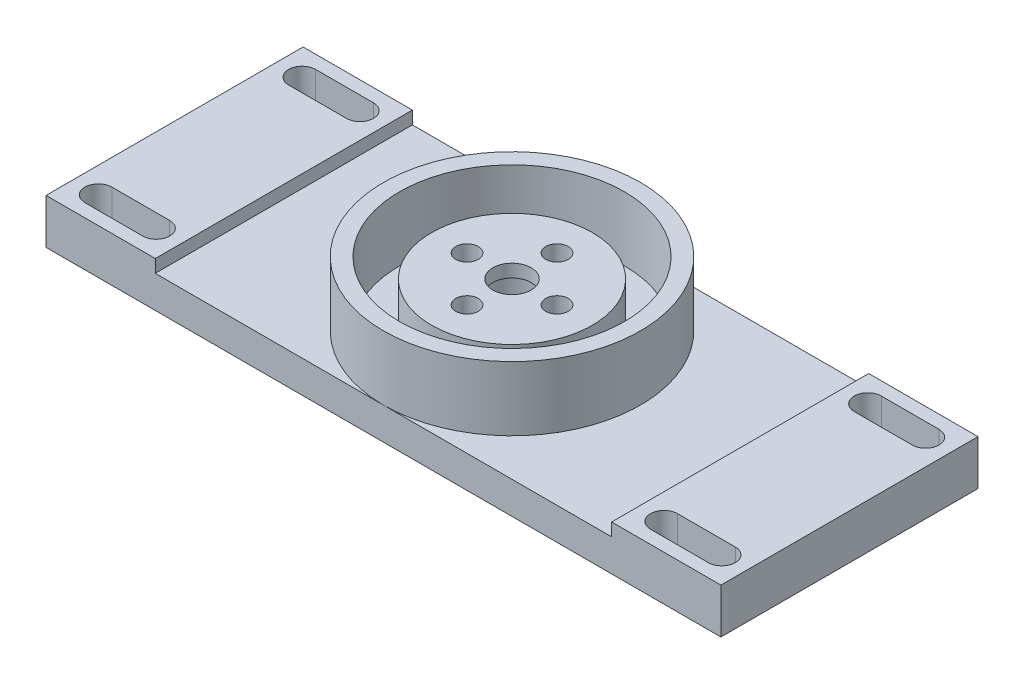
ISO-10303-21;
HEADER;
FILE_DESCRIPTION(('STEP AP214'),'2;1');
FILE_NAME('part.step','',(''),(''),'','','');
FILE_SCHEMA(('AUTOMOTIVE_DESIGN { 1 0 10303 214 1 1 1 1 }'));
ENDSEC;
DATA;
#1=APPLICATION_CONTEXT('core data for automotive mechanical design processes');
#2=APPLICATION_PROTOCOL_DEFINITION('international standard','automotive_design',2000,#1);
#3=PRODUCT_CONTEXT('',#1,'mechanical');
#4=PRODUCT('Part','Part','',(#3));
#5=PRODUCT_RELATED_PRODUCT_CATEGORY('part','',(#4));
#6=PRODUCT_DEFINITION_FORMATION('','',#4);
#7=PRODUCT_DEFINITION_CONTEXT('part definition',#1,'design');
#8=PRODUCT_DEFINITION('design','',#6,#7);
#9=PRODUCT_DEFINITION_SHAPE('','',#8);
#10=(LENGTH_UNIT() NAMED_UNIT(*) SI_UNIT(.MILLI.,.METRE.));
#11=(NAMED_UNIT(*) PLANE_ANGLE_UNIT() SI_UNIT($,.RADIAN.));
#12=(NAMED_UNIT(*) SI_UNIT($,.STERADIAN.) SOLID_ANGLE_UNIT());
#13=UNCERTAINTY_MEASURE_WITH_UNIT(LENGTH_MEASURE(1.E-05),#10,'distance_accuracy_value','');
#14=(GEOMETRIC_REPRESENTATION_CONTEXT(3) GLOBAL_UNCERTAINTY_ASSIGNED_CONTEXT((#13)) GLOBAL_UNIT_ASSIGNED_CONTEXT((#10,
#11,#12)) REPRESENTATION_CONTEXT('',''));
#15=CARTESIAN_POINT('',(0.,0.,0.));
#16=DIRECTION('',(0.,0.,1.));
#17=DIRECTION('',(1.,0.,0.));
#18=AXIS2_PLACEMENT_3D('',#15,#16,#17);
#19=CARTESIAN_POINT('',(52.5,0.,-20.));
#20=DIRECTION('',(0.,1.,0.));
#21=DIRECTION('',(0.,0.,1.));
#22=AXIS2_PLACEMENT_3D('',#19,#20,#21);
#23=CYLINDRICAL_SURFACE('',#22,3.);
#24=CARTESIAN_POINT('',(52.5,12.,-20.));
#25=DIRECTION('',(0.,1.,0.));
#26=DIRECTION('',(0.,0.,1.));
#27=AXIS2_PLACEMENT_3D('',#24,#25,#26);
#28=CIRCLE('',#27,3.);
#29=CARTESIAN_POINT('',(52.5,12.,-17.));
#30=VERTEX_POINT('',#29);
#31=EDGE_CURVE('E696',#30,#30,#28,.T.);
#32=ORIENTED_EDGE('',*,*,#31,.T.);
#33=EDGE_LOOP('',(#32));
#34=FACE_BOUND('',#33,.T.);
#35=CARTESIAN_POINT('',(52.5,10.,-20.));
#36=DIRECTION('',(0.,-1.,0.));
#37=DIRECTION('',(0.,0.,-1.));
#38=AXIS2_PLACEMENT_3D('',#35,#36,#37);
#39=CIRCLE('',#38,3.);
#40=CARTESIAN_POINT('',(52.5,10.,-23.));
#41=VERTEX_POINT('',#40);
#42=EDGE_CURVE('E45',#41,#41,#39,.F.);
#43=ORIENTED_EDGE('',*,*,#42,.F.);
#44=EDGE_LOOP('',(#43));
#45=FACE_BOUND('',#44,.T.);
#46=ADVANCED_FACE('F41',(#34,#45),#23,.F.);
#47=CARTESIAN_POINT('',(52.5,15.,-20.));
#48=DIRECTION('',(0.,-1.,0.));
#49=DIRECTION('',(0.,0.,-1.));
#50=AXIS2_PLACEMENT_3D('',#47,#48,#49);
#51=CYLINDRICAL_SURFACE('',#50,12.5);
#52=CARTESIAN_POINT('',(52.5,5.,-20.));
#53=DIRECTION('',(0.,-1.,0.));
#54=DIRECTION('',(0.,0.,-1.));
#55=AXIS2_PLACEMENT_3D('',#52,#53,#54);
#56=CIRCLE('',#55,12.5);
#57=CARTESIAN_POINT('',(52.5,5.,-32.5));
#58=VERTEX_POINT('',#57);
#59=EDGE_CURVE('E12',#58,#58,#56,.F.);
#60=ORIENTED_EDGE('',*,*,#59,.T.);
#61=EDGE_LOOP('',(#60));
#62=FACE_BOUND('',#61,.T.);
#63=CARTESIAN_POINT('',(52.5,12.,-20.));
#64=DIRECTION('',(0.,1.,0.));
#65=DIRECTION('',(0.,0.,1.));
#66=AXIS2_PLACEMENT_3D('',#63,#64,#65);
#67=CIRCLE('',#66,12.5);
#68=CARTESIAN_POINT('',(52.5,12.,-7.50000000000001));
#69=VERTEX_POINT('',#68);
#70=EDGE_CURVE('E238',#69,#69,#67,.T.);
#71=ORIENTED_EDGE('',*,*,#70,.F.);
#72=EDGE_LOOP('',(#71));
#73=FACE_BOUND('',#72,.T.);
#74=ADVANCED_FACE('F454',(#62,#73),#51,.T.);
#75=CARTESIAN_POINT('',(0.,5.,0.));
#76=DIRECTION('',(0.,-1.,0.));
#77=DIRECTION('',(0.,0.,-1.));
#78=AXIS2_PLACEMENT_3D('',#75,#76,#77);
#79=PLANE('',#78);
#80=CARTESIAN_POINT('',(52.5,5.,-20.));
#81=DIRECTION('',(0.,-1.,0.));
#82=DIRECTION('',(0.,0.,-1.));
#83=AXIS2_PLACEMENT_3D('',#80,#81,#82);
#84=CIRCLE('',#83,20.);
#85=CARTESIAN_POINT('',(52.5,5.,-40.));
#86=VERTEX_POINT('',#85);
#87=CARTESIAN_POINT('',(52.5,5.,0.));
#88=VERTEX_POINT('',#87);
#89=EDGE_CURVE('E50',#86,#88,#84,.F.);
#90=ORIENTED_EDGE('',*,*,#89,.F.);
#91=DIRECTION('',(-1.,0.,0.));
#92=VECTOR('',#91,1.);
#93=CARTESIAN_POINT('',(17.,5.,-40.));
#94=LINE('',#93,#92);
#95=CARTESIAN_POINT('',(17.,5.,-40.));
#96=VERTEX_POINT('',#95);
#97=EDGE_CURVE('E212',#86,#96,#94,.T.);
#98=ORIENTED_EDGE('',*,*,#97,.T.);
#99=DIRECTION('',(0.,0.,1.));
#100=VECTOR('',#99,1.);
#101=CARTESIAN_POINT('',(17.,5.,0.));
#102=LINE('',#101,#100);
#103=CARTESIAN_POINT('',(17.,5.,0.));
#104=VERTEX_POINT('',#103);
#105=EDGE_CURVE('E242',#96,#104,#102,.T.);
#106=ORIENTED_EDGE('',*,*,#105,.T.);
#107=DIRECTION('',(1.,0.,0.));
#108=VECTOR('',#107,1.);
#109=CARTESIAN_POINT('',(17.,5.,0.));
#110=LINE('',#109,#108);
#111=EDGE_CURVE('E226',#104,#88,#110,.T.);
#112=ORIENTED_EDGE('',*,*,#111,.T.);
#113=EDGE_LOOP('',(#90,#98,#106,#112));
#114=FACE_BOUND('',#113,.T.);
#115=ADVANCED_FACE('F224',(#114),#79,.F.);
#116=CARTESIAN_POINT('',(0.,7.,0.));
#117=DIRECTION('',(0.,-1.,0.));
#118=DIRECTION('',(0.,0.,-1.));
#119=AXIS2_PLACEMENT_3D('',#116,#117,#118);
#120=PLANE('',#119);
#121=CARTESIAN_POINT('',(4.00000000000033,7.,-4.15));
#122=DIRECTION('',(0.,1.,0.));
#123=DIRECTION('',(0.,0.,1.));
#124=AXIS2_PLACEMENT_3D('',#121,#122,#123);
#125=CIRCLE('',#124,2.1);
#126=CARTESIAN_POINT('',(4.00000000000033,7.,-6.25));
#127=VERTEX_POINT('',#126);
#128=CARTESIAN_POINT('',(4.00000000000033,7.,-2.05));
#129=VERTEX_POINT('',#128);
#130=EDGE_CURVE('E321',#127,#129,#125,.T.);
#131=ORIENTED_EDGE('',*,*,#130,.F.);
#132=DIRECTION('',(-1.,0.,0.));
#133=VECTOR('',#132,1.);
#134=CARTESIAN_POINT('',(4.00000000000033,7.,-6.25));
#135=LINE('',#134,#133);
#136=CARTESIAN_POINT('',(13.0000000000003,7.,-6.25));
#137=VERTEX_POINT('',#136);
#138=EDGE_CURVE('E329',#137,#127,#135,.T.);
#139=ORIENTED_EDGE('',*,*,#138,.F.);
#140=CARTESIAN_POINT('',(13.0000000000003,7.,-4.15));
#141=DIRECTION('',(0.,1.,0.));
#142=DIRECTION('',(0.,0.,1.));
#143=AXIS2_PLACEMENT_3D('',#140,#141,#142);
#144=CIRCLE('',#143,2.1);
#145=CARTESIAN_POINT('',(13.0000000000003,7.,-2.05));
#146=VERTEX_POINT('',#145);
#147=EDGE_CURVE('E326',#146,#137,#144,.T.);
#148=ORIENTED_EDGE('',*,*,#147,.F.);
#149=DIRECTION('',(1.,0.,0.));
#150=VECTOR('',#149,1.);
#151=CARTESIAN_POINT('',(4.00000000000033,7.,-2.05));
#152=LINE('',#151,#150);
#153=EDGE_CURVE('E323',#129,#146,#152,.T.);
#154=ORIENTED_EDGE('',*,*,#153,.F.);
#155=EDGE_LOOP('',(#131,#139,#148,#154));
#156=FACE_BOUND('',#155,.T.);
#157=CARTESIAN_POINT('',(4.,7.,-35.85));
#158=DIRECTION('',(0.,1.,0.));
#159=DIRECTION('',(0.,0.,1.));
#160=AXIS2_PLACEMENT_3D('',#157,#158,#159);
#161=CIRCLE('',#160,2.1);
#162=CARTESIAN_POINT('',(4.,7.,-37.95));
#163=VERTEX_POINT('',#162);
#164=CARTESIAN_POINT('',(4.,7.,-33.75));
#165=VERTEX_POINT('',#164);
#166=EDGE_CURVE('E352',#163,#165,#161,.T.);
#167=ORIENTED_EDGE('',*,*,#166,.F.);
#168=DIRECTION('',(-1.,0.,0.));
#169=VECTOR('',#168,1.);
#170=CARTESIAN_POINT('',(4.,7.,-37.95));
#171=LINE('',#170,#169);
#172=CARTESIAN_POINT('',(13.,7.,-37.95));
#173=VERTEX_POINT('',#172);
#174=EDGE_CURVE('E360',#173,#163,#171,.T.);
#175=ORIENTED_EDGE('',*,*,#174,.F.);
#176=CARTESIAN_POINT('',(13.,7.,-35.85));
#177=DIRECTION('',(0.,1.,0.));
#178=DIRECTION('',(0.,0.,1.));
#179=AXIS2_PLACEMENT_3D('',#176,#177,#178);
#180=CIRCLE('',#179,2.1);
#181=CARTESIAN_POINT('',(13.,7.,-33.75));
#182=VERTEX_POINT('',#181);
#183=EDGE_CURVE('E357',#182,#173,#180,.T.);
#184=ORIENTED_EDGE('',*,*,#183,.F.);
#185=DIRECTION('',(1.,0.,0.));
#186=VECTOR('',#185,1.);
#187=CARTESIAN_POINT('',(4.,7.,-33.75));
#188=LINE('',#187,#186);
#189=EDGE_CURVE('E354',#165,#182,#188,.T.);
#190=ORIENTED_EDGE('',*,*,#189,.F.);
#191=EDGE_LOOP('',(#167,#175,#184,#190));
#192=FACE_BOUND('',#191,.T.);
#193=DIRECTION('',(1.,0.,0.));
#194=VECTOR('',#193,1.);
#195=CARTESIAN_POINT('',(0.,7.,0.));
#196=LINE('',#195,#194);
#197=CARTESIAN_POINT('',(0.,7.,0.));
#198=VERTEX_POINT('',#197);
#199=CARTESIAN_POINT('',(17.,7.,0.));
#200=VERTEX_POINT('',#199);
#201=EDGE_CURVE('E388',#198,#200,#196,.T.);
#202=ORIENTED_EDGE('',*,*,#201,.T.);
#203=DIRECTION('',(0.,0.,1.));
#204=VECTOR('',#203,1.);
#205=CARTESIAN_POINT('',(17.,7.,0.));
#206=LINE('',#205,#204);
#207=CARTESIAN_POINT('',(17.,7.,-40.));
#208=VERTEX_POINT('',#207);
#209=EDGE_CURVE('E248',#208,#200,#206,.T.);
#210=ORIENTED_EDGE('',*,*,#209,.F.);
#211=DIRECTION('',(-1.,0.,0.));
#212=VECTOR('',#211,1.);
#213=CARTESIAN_POINT('',(0.,7.,-40.));
#214=LINE('',#213,#212);
#215=CARTESIAN_POINT('',(0.,7.,-40.));
#216=VERTEX_POINT('',#215);
#217=EDGE_CURVE('E393',#208,#216,#214,.T.);
#218=ORIENTED_EDGE('',*,*,#217,.T.);
#219=DIRECTION('',(0.,0.,1.));
#220=VECTOR('',#219,1.);
#221=CARTESIAN_POINT('',(0.,7.,0.));
#222=LINE('',#221,#220);
#223=EDGE_CURVE('E383',#216,#198,#222,.T.);
#224=ORIENTED_EDGE('',*,*,#223,.T.);
#225=EDGE_LOOP('',(#202,#210,#218,#224));
#226=FACE_BOUND('',#225,.T.);
#227=ADVANCED_FACE('F493',(#156,#192,#226),#120,.F.);
#228=CARTESIAN_POINT('',(92.,7.,-35.85));
#229=DIRECTION('',(0.,1.,0.));
#230=DIRECTION('',(0.,0.,1.));
#231=AXIS2_PLACEMENT_3D('',#228,#229,#230);
#232=CIRCLE('',#231,2.1);
#233=CARTESIAN_POINT('',(92.,7.,-37.95));
#234=VERTEX_POINT('',#233);
#235=CARTESIAN_POINT('',(92.,7.,-33.75));
#236=VERTEX_POINT('',#235);
#237=EDGE_CURVE('E290',#234,#236,#232,.T.);
#238=ORIENTED_EDGE('',*,*,#237,.F.);
#239=DIRECTION('',(-1.,0.,0.));
#240=VECTOR('',#239,1.);
#241=CARTESIAN_POINT('',(92.,7.,-37.95));
#242=LINE('',#241,#240);
#243=CARTESIAN_POINT('',(101.,7.,-37.95));
#244=VERTEX_POINT('',#243);
#245=EDGE_CURVE('E298',#244,#234,#242,.T.);
#246=ORIENTED_EDGE('',*,*,#245,.F.);
#247=CARTESIAN_POINT('',(101.,7.,-35.85));
#248=DIRECTION('',(0.,1.,0.));
#249=DIRECTION('',(0.,0.,1.));
#250=AXIS2_PLACEMENT_3D('',#247,#248,#249);
#251=CIRCLE('',#250,2.1);
#252=CARTESIAN_POINT('',(101.,7.,-33.75));
#253=VERTEX_POINT('',#252);
#254=EDGE_CURVE('E295',#253,#244,#251,.T.);
#255=ORIENTED_EDGE('',*,*,#254,.F.);
#256=DIRECTION('',(1.,0.,0.));
#257=VECTOR('',#256,1.);
#258=CARTESIAN_POINT('',(92.,7.,-33.75));
#259=LINE('',#258,#257);
#260=EDGE_CURVE('E292',#236,#253,#259,.T.);
#261=ORIENTED_EDGE('',*,*,#260,.F.);
#262=EDGE_LOOP('',(#238,#246,#255,#261));
#263=FACE_BOUND('',#262,.T.);
#264=CARTESIAN_POINT('',(105.,7.,-40.));
#265=VERTEX_POINT('',#264);
#266=CARTESIAN_POINT('',(88.,7.,-40.));
#267=VERTEX_POINT('',#266);
#268=EDGE_CURVE('E394',#265,#267,#214,.T.);
#269=ORIENTED_EDGE('',*,*,#268,.T.);
#270=DIRECTION('',(0.,0.,-1.));
#271=VECTOR('',#270,1.);
#272=CARTESIAN_POINT('',(88.,7.,0.));
#273=LINE('',#272,#271);
#274=CARTESIAN_POINT('',(88.,7.,0.));
#275=VERTEX_POINT('',#274);
#276=EDGE_CURVE('E245',#275,#267,#273,.T.);
#277=ORIENTED_EDGE('',*,*,#276,.F.);
#278=CARTESIAN_POINT('',(105.,7.,0.));
#279=VERTEX_POINT('',#278);
#280=EDGE_CURVE('E386',#275,#279,#196,.T.);
#281=ORIENTED_EDGE('',*,*,#280,.T.);
#282=DIRECTION('',(0.,0.,-1.));
#283=VECTOR('',#282,1.);
#284=CARTESIAN_POINT('',(105.,7.,0.));
#285=LINE('',#284,#283);
#286=EDGE_CURVE('E391',#279,#265,#285,.T.);
#287=ORIENTED_EDGE('',*,*,#286,.T.);
#288=EDGE_LOOP('',(#269,#277,#281,#287));
#289=FACE_BOUND('',#288,.T.);
#290=CARTESIAN_POINT('',(92.0000000000003,7.,-4.15));
#291=DIRECTION('',(0.,1.,0.));
#292=DIRECTION('',(0.,0.,1.));
#293=AXIS2_PLACEMENT_3D('',#290,#291,#292);
#294=CIRCLE('',#293,2.1);
#295=CARTESIAN_POINT('',(92.0000000000003,7.,-6.25));
#296=VERTEX_POINT('',#295);
#297=CARTESIAN_POINT('',(92.0000000000003,7.,-2.05));
#298=VERTEX_POINT('',#297);
#299=EDGE_CURVE('E259',#296,#298,#294,.T.);
#300=ORIENTED_EDGE('',*,*,#299,.F.);
#301=DIRECTION('',(-1.,0.,0.));
#302=VECTOR('',#301,1.);
#303=CARTESIAN_POINT('',(92.0000000000003,7.,-6.25));
#304=LINE('',#303,#302);
#305=CARTESIAN_POINT('',(101.,7.,-6.25));
#306=VERTEX_POINT('',#305);
#307=EDGE_CURVE('E267',#306,#296,#304,.T.);
#308=ORIENTED_EDGE('',*,*,#307,.F.);
#309=CARTESIAN_POINT('',(101.,7.,-4.15));
#310=DIRECTION('',(0.,1.,0.));
#311=DIRECTION('',(0.,0.,1.));
#312=AXIS2_PLACEMENT_3D('',#309,#310,#311);
#313=CIRCLE('',#312,2.1);
#314=CARTESIAN_POINT('',(101.,7.,-2.05));
#315=VERTEX_POINT('',#314);
#316=EDGE_CURVE('E264',#315,#306,#313,.T.);
#317=ORIENTED_EDGE('',*,*,#316,.F.);
#318=DIRECTION('',(1.,0.,0.));
#319=VECTOR('',#318,1.);
#320=CARTESIAN_POINT('',(92.0000000000003,7.,-2.05));
#321=LINE('',#320,#319);
#322=EDGE_CURVE('E261',#298,#315,#321,.T.);
#323=ORIENTED_EDGE('',*,*,#322,.F.);
#324=EDGE_LOOP('',(#300,#308,#317,#323));
#325=FACE_BOUND('',#324,.T.);
#326=ADVANCED_FACE('F434',(#263,#289,#325),#120,.F.);
#327=CARTESIAN_POINT('',(0.,0.,0.));
#328=DIRECTION('',(0.,-1.,0.));
#329=DIRECTION('',(0.,0.,-1.));
#330=AXIS2_PLACEMENT_3D('',#327,#328,#329);
#331=PLANE('',#330);
#332=CARTESIAN_POINT('',(52.5,0.,-20.));
#333=DIRECTION('',(0.,-1.,0.));
#334=DIRECTION('',(0.,0.,-1.));
#335=AXIS2_PLACEMENT_3D('',#332,#333,#334);
#336=CIRCLE('',#335,4.5);
#337=CARTESIAN_POINT('',(52.5,0.,-24.5));
#338=VERTEX_POINT('',#337);
#339=EDGE_CURVE('E670',#338,#338,#336,.T.);
#340=ORIENTED_EDGE('',*,*,#339,.F.);
#341=EDGE_LOOP('',(#340));
#342=FACE_BOUND('',#341,.T.);
#343=CARTESIAN_POINT('',(52.5000000000001,0.,-12.9999999999997));
#344=DIRECTION('',(0.,1.,0.));
#345=DIRECTION('',(0.,0.,1.));
#346=AXIS2_PLACEMENT_3D('',#343,#344,#345);
#347=CIRCLE('',#346,1.75000000000001);
#348=CARTESIAN_POINT('',(52.5000000000001,0.,-11.2499999999997));
#349=VERTEX_POINT('',#348);
#350=EDGE_CURVE('E674',#349,#349,#347,.T.);
#351=ORIENTED_EDGE('',*,*,#350,.T.);
#352=EDGE_LOOP('',(#351));
#353=FACE_BOUND('',#352,.T.);
#354=CARTESIAN_POINT('',(59.5,0.,-20.));
#355=DIRECTION('',(0.,1.,0.));
#356=DIRECTION('',(0.,0.,1.));
#357=AXIS2_PLACEMENT_3D('',#354,#355,#356);
#358=CIRCLE('',#357,1.74999999999976);
#359=CARTESIAN_POINT('',(59.5,0.,-18.2500000000002));
#360=VERTEX_POINT('',#359);
#361=EDGE_CURVE('E681',#360,#360,#358,.T.);
#362=ORIENTED_EDGE('',*,*,#361,.T.);
#363=EDGE_LOOP('',(#362));
#364=FACE_BOUND('',#363,.T.);
#365=CARTESIAN_POINT('',(52.5,0.,-27.));
#366=DIRECTION('',(0.,1.,0.));
#367=DIRECTION('',(0.,0.,1.));
#368=AXIS2_PLACEMENT_3D('',#365,#366,#367);
#369=CIRCLE('',#368,1.74999999999848);
#370=CARTESIAN_POINT('',(52.5,0.,-25.2500000000015));
#371=VERTEX_POINT('',#370);
#372=EDGE_CURVE('E687',#371,#371,#369,.T.);
#373=ORIENTED_EDGE('',*,*,#372,.T.);
#374=EDGE_LOOP('',(#373));
#375=FACE_BOUND('',#374,.T.);
#376=CARTESIAN_POINT('',(45.5,0.,-20.));
#377=DIRECTION('',(0.,1.,0.));
#378=DIRECTION('',(0.,0.,1.));
#379=AXIS2_PLACEMENT_3D('',#376,#377,#378);
#380=CIRCLE('',#379,1.75);
#381=CARTESIAN_POINT('',(45.5,0.,-18.25));
#382=VERTEX_POINT('',#381);
#383=EDGE_CURVE('E693',#382,#382,#380,.T.);
#384=ORIENTED_EDGE('',*,*,#383,.T.);
#385=EDGE_LOOP('',(#384));
#386=FACE_BOUND('',#385,.T.);
#387=DIRECTION('',(0.,0.,1.));
#388=VECTOR('',#387,1.);
#389=CARTESIAN_POINT('',(0.,0.,0.));
#390=LINE('',#389,#388);
#391=CARTESIAN_POINT('',(0.,0.,-40.));
#392=VERTEX_POINT('',#391);
#393=CARTESIAN_POINT('',(0.,0.,0.));
#394=VERTEX_POINT('',#393);
#395=EDGE_CURVE('E382',#392,#394,#390,.T.);
#396=ORIENTED_EDGE('',*,*,#395,.F.);
#397=DIRECTION('',(-1.,0.,0.));
#398=VECTOR('',#397,1.);
#399=CARTESIAN_POINT('',(0.,0.,-40.));
#400=LINE('',#399,#398);
#401=CARTESIAN_POINT('',(105.,0.,-40.));
#402=VERTEX_POINT('',#401);
#403=EDGE_CURVE('E387',#402,#392,#400,.T.);
#404=ORIENTED_EDGE('',*,*,#403,.F.);
#405=DIRECTION('',(0.,0.,-1.));
#406=VECTOR('',#405,1.);
#407=CARTESIAN_POINT('',(105.,0.,0.));
#408=LINE('',#407,#406);
#409=CARTESIAN_POINT('',(105.,0.,0.));
#410=VERTEX_POINT('',#409);
#411=EDGE_CURVE('E402',#410,#402,#408,.T.);
#412=ORIENTED_EDGE('',*,*,#411,.F.);
#413=DIRECTION('',(1.,0.,0.));
#414=VECTOR('',#413,1.);
#415=CARTESIAN_POINT('',(0.,0.,0.));
#416=LINE('',#415,#414);
#417=EDGE_CURVE('E400',#394,#410,#416,.T.);
#418=ORIENTED_EDGE('',*,*,#417,.F.);
#419=EDGE_LOOP('',(#396,#404,#412,#418));
#420=FACE_BOUND('',#419,.T.);
#421=DIRECTION('',(-1.,0.,0.));
#422=VECTOR('',#421,1.);
#423=CARTESIAN_POINT('',(4.,0.,-37.95));
#424=LINE('',#423,#422);
#425=CARTESIAN_POINT('',(13.,0.,-37.95));
#426=VERTEX_POINT('',#425);
#427=CARTESIAN_POINT('',(4.,0.,-37.95));
#428=VERTEX_POINT('',#427);
#429=EDGE_CURVE('E355',#426,#428,#424,.T.);
#430=ORIENTED_EDGE('',*,*,#429,.T.);
#431=CARTESIAN_POINT('',(4.,0.,-35.85));
#432=DIRECTION('',(0.,1.,0.));
#433=DIRECTION('',(0.,0.,1.));
#434=AXIS2_PLACEMENT_3D('',#431,#432,#433);
#435=CIRCLE('',#434,2.1);
#436=CARTESIAN_POINT('',(4.,0.,-33.75));
#437=VERTEX_POINT('',#436);
#438=EDGE_CURVE('E351',#428,#437,#435,.T.);
#439=ORIENTED_EDGE('',*,*,#438,.T.);
#440=DIRECTION('',(1.,0.,0.));
#441=VECTOR('',#440,1.);
#442=CARTESIAN_POINT('',(4.,0.,-33.75));
#443=LINE('',#442,#441);
#444=CARTESIAN_POINT('',(13.,0.,-33.75));
#445=VERTEX_POINT('',#444);
#446=EDGE_CURVE('E365',#437,#445,#443,.T.);
#447=ORIENTED_EDGE('',*,*,#446,.T.);
#448=CARTESIAN_POINT('',(13.,0.,-35.85));
#449=DIRECTION('',(0.,1.,0.));
#450=DIRECTION('',(0.,0.,1.));
#451=AXIS2_PLACEMENT_3D('',#448,#449,#450);
#452=CIRCLE('',#451,2.1);
#453=EDGE_CURVE('E368',#445,#426,#452,.T.);
#454=ORIENTED_EDGE('',*,*,#453,.T.);
#455=EDGE_LOOP('',(#430,#439,#447,#454));
#456=FACE_BOUND('',#455,.T.);
#457=DIRECTION('',(-1.,0.,0.));
#458=VECTOR('',#457,1.);
#459=CARTESIAN_POINT('',(4.00000000000033,0.,-6.25));
#460=LINE('',#459,#458);
#461=CARTESIAN_POINT('',(13.0000000000003,0.,-6.25));
#462=VERTEX_POINT('',#461);
#463=CARTESIAN_POINT('',(4.00000000000033,0.,-6.25));
#464=VERTEX_POINT('',#463);
#465=EDGE_CURVE('E324',#462,#464,#460,.T.);
#466=ORIENTED_EDGE('',*,*,#465,.T.);
#467=CARTESIAN_POINT('',(4.00000000000033,0.,-4.15));
#468=DIRECTION('',(0.,1.,0.));
#469=DIRECTION('',(0.,0.,1.));
#470=AXIS2_PLACEMENT_3D('',#467,#468,#469);
#471=CIRCLE('',#470,2.1);
#472=CARTESIAN_POINT('',(4.00000000000033,0.,-2.05));
#473=VERTEX_POINT('',#472);
#474=EDGE_CURVE('E320',#464,#473,#471,.T.);
#475=ORIENTED_EDGE('',*,*,#474,.T.);
#476=DIRECTION('',(1.,0.,0.));
#477=VECTOR('',#476,1.);
#478=CARTESIAN_POINT('',(4.00000000000033,0.,-2.05));
#479=LINE('',#478,#477);
#480=CARTESIAN_POINT('',(13.0000000000003,0.,-2.05));
#481=VERTEX_POINT('',#480);
#482=EDGE_CURVE('E334',#473,#481,#479,.T.);
#483=ORIENTED_EDGE('',*,*,#482,.T.);
#484=CARTESIAN_POINT('',(13.0000000000003,0.,-4.15));
#485=DIRECTION('',(0.,1.,0.));
#486=DIRECTION('',(0.,0.,1.));
#487=AXIS2_PLACEMENT_3D('',#484,#485,#486);
#488=CIRCLE('',#487,2.1);
#489=EDGE_CURVE('E337',#481,#462,#488,.T.);
#490=ORIENTED_EDGE('',*,*,#489,.T.);
#491=EDGE_LOOP('',(#466,#475,#483,#490));
#492=FACE_BOUND('',#491,.T.);
#493=DIRECTION('',(-1.,0.,0.));
#494=VECTOR('',#493,1.);
#495=CARTESIAN_POINT('',(92.,0.,-37.95));
#496=LINE('',#495,#494);
#497=CARTESIAN_POINT('',(101.,0.,-37.95));
#498=VERTEX_POINT('',#497);
#499=CARTESIAN_POINT('',(92.,0.,-37.95));
#500=VERTEX_POINT('',#499);
#501=EDGE_CURVE('E293',#498,#500,#496,.T.);
#502=ORIENTED_EDGE('',*,*,#501,.T.);
#503=CARTESIAN_POINT('',(92.,0.,-35.85));
#504=DIRECTION('',(0.,1.,0.));
#505=DIRECTION('',(0.,0.,1.));
#506=AXIS2_PLACEMENT_3D('',#503,#504,#505);
#507=CIRCLE('',#506,2.1);
#508=CARTESIAN_POINT('',(92.,0.,-33.75));
#509=VERTEX_POINT('',#508);
#510=EDGE_CURVE('E289',#500,#509,#507,.T.);
#511=ORIENTED_EDGE('',*,*,#510,.T.);
#512=DIRECTION('',(1.,0.,0.));
#513=VECTOR('',#512,1.);
#514=CARTESIAN_POINT('',(92.,0.,-33.75));
#515=LINE('',#514,#513);
#516=CARTESIAN_POINT('',(101.,0.,-33.75));
#517=VERTEX_POINT('',#516);
#518=EDGE_CURVE('E303',#509,#517,#515,.T.);
#519=ORIENTED_EDGE('',*,*,#518,.T.);
#520=CARTESIAN_POINT('',(101.,0.,-35.85));
#521=DIRECTION('',(0.,1.,0.));
#522=DIRECTION('',(0.,0.,1.));
#523=AXIS2_PLACEMENT_3D('',#520,#521,#522);
#524=CIRCLE('',#523,2.1);
#525=EDGE_CURVE('E306',#517,#498,#524,.T.);
#526=ORIENTED_EDGE('',*,*,#525,.T.);
#527=EDGE_LOOP('',(#502,#511,#519,#526));
#528=FACE_BOUND('',#527,.T.);
#529=DIRECTION('',(-1.,0.,0.));
#530=VECTOR('',#529,1.);
#531=CARTESIAN_POINT('',(92.0000000000003,0.,-6.25));
#532=LINE('',#531,#530);
#533=CARTESIAN_POINT('',(101.,0.,-6.25));
#534=VERTEX_POINT('',#533);
#535=CARTESIAN_POINT('',(92.0000000000003,0.,-6.25));
#536=VERTEX_POINT('',#535);
#537=EDGE_CURVE('E262',#534,#536,#532,.T.);
#538=ORIENTED_EDGE('',*,*,#537,.T.);
#539=CARTESIAN_POINT('',(92.0000000000003,0.,-4.15));
#540=DIRECTION('',(0.,1.,0.));
#541=DIRECTION('',(0.,0.,1.));
#542=AXIS2_PLACEMENT_3D('',#539,#540,#541);
#543=CIRCLE('',#542,2.1);
#544=CARTESIAN_POINT('',(92.0000000000003,0.,-2.05));
#545=VERTEX_POINT('',#544);
#546=EDGE_CURVE('E252',#536,#545,#543,.T.);
#547=ORIENTED_EDGE('',*,*,#546,.T.);
#548=DIRECTION('',(1.,0.,0.));
#549=VECTOR('',#548,1.);
#550=CARTESIAN_POINT('',(92.0000000000003,0.,-2.05));
#551=LINE('',#550,#549);
#552=CARTESIAN_POINT('',(101.,0.,-2.05));
#553=VERTEX_POINT('',#552);
#554=EDGE_CURVE('E272',#545,#553,#551,.T.);
#555=ORIENTED_EDGE('',*,*,#554,.T.);
#556=CARTESIAN_POINT('',(101.,0.,-4.15));
#557=DIRECTION('',(0.,1.,0.));
#558=DIRECTION('',(0.,0.,1.));
#559=AXIS2_PLACEMENT_3D('',#556,#557,#558);
#560=CIRCLE('',#559,2.1);
#561=EDGE_CURVE('E275',#553,#534,#560,.T.);
#562=ORIENTED_EDGE('',*,*,#561,.T.);
#563=EDGE_LOOP('',(#538,#547,#555,#562));
#564=FACE_BOUND('',#563,.T.);
#565=ADVANCED_FACE('F424',(#342,#353,#364,#375,#386,#420,#456,#492,#528,#564),#331,.T.);
#566=CARTESIAN_POINT('',(0.,7.,0.));
#567=DIRECTION('',(1.,0.,0.));
#568=DIRECTION('',(0.,0.,-1.));
#569=AXIS2_PLACEMENT_3D('',#566,#567,#568);
#570=PLANE('',#569);
#571=ORIENTED_EDGE('',*,*,#395,.T.);
#572=DIRECTION('',(0.,-1.,0.));
#573=VECTOR('',#572,1.);
#574=CARTESIAN_POINT('',(0.,7.,0.));
#575=LINE('',#574,#573);
#576=EDGE_CURVE('E228',#198,#394,#575,.T.);
#577=ORIENTED_EDGE('',*,*,#576,.F.);
#578=ORIENTED_EDGE('',*,*,#223,.F.);
#579=DIRECTION('',(0.,-1.,0.));
#580=VECTOR('',#579,1.);
#581=CARTESIAN_POINT('',(0.,7.,-40.));
#582=LINE('',#581,#580);
#583=EDGE_CURVE('E397',#216,#392,#582,.T.);
#584=ORIENTED_EDGE('',*,*,#583,.T.);
#585=EDGE_LOOP('',(#571,#577,#578,#584));
#586=FACE_BOUND('',#585,.T.);
#587=ADVANCED_FACE('F43',(#586),#570,.F.);
#588=CARTESIAN_POINT('',(0.,7.,0.));
#589=DIRECTION('',(0.,0.,-1.));
#590=DIRECTION('',(-1.,0.,0.));
#591=AXIS2_PLACEMENT_3D('',#588,#589,#590);
#592=PLANE('',#591);
#593=ORIENTED_EDGE('',*,*,#111,.F.);
#594=DIRECTION('',(0.,1.,0.));
#595=VECTOR('',#594,1.);
#596=CARTESIAN_POINT('',(17.,5.,0.));
#597=LINE('',#596,#595);
#598=EDGE_CURVE('E211',#104,#200,#597,.T.);
#599=ORIENTED_EDGE('',*,*,#598,.T.);
#600=ORIENTED_EDGE('',*,*,#201,.F.);
#601=ORIENTED_EDGE('',*,*,#576,.T.);
#602=ORIENTED_EDGE('',*,*,#417,.T.);
#603=DIRECTION('',(0.,-1.,0.));
#604=VECTOR('',#603,1.);
#605=CARTESIAN_POINT('',(105.,7.,0.));
#606=LINE('',#605,#604);
#607=EDGE_CURVE('E410',#279,#410,#606,.T.);
#608=ORIENTED_EDGE('',*,*,#607,.F.);
#609=ORIENTED_EDGE('',*,*,#280,.F.);
#610=DIRECTION('',(0.,1.,0.));
#611=VECTOR('',#610,1.);
#612=CARTESIAN_POINT('',(88.,5.,0.));
#613=LINE('',#612,#611);
#614=CARTESIAN_POINT('',(88.,5.,0.));
#615=VERTEX_POINT('',#614);
#616=EDGE_CURVE('E255',#615,#275,#613,.T.);
#617=ORIENTED_EDGE('',*,*,#616,.F.);
#618=EDGE_CURVE('E244',#88,#615,#110,.T.);
#619=ORIENTED_EDGE('',*,*,#618,.F.);
#620=EDGE_LOOP('',(#593,#599,#600,#601,#602,#608,#609,#617,#619));
#621=FACE_BOUND('',#620,.T.);
#622=ADVANCED_FACE('F416',(#621),#592,.F.);
#623=CARTESIAN_POINT('',(105.,7.,0.));
#624=DIRECTION('',(-1.,0.,0.));
#625=DIRECTION('',(0.,0.,1.));
#626=AXIS2_PLACEMENT_3D('',#623,#624,#625);
#627=PLANE('',#626);
#628=ORIENTED_EDGE('',*,*,#411,.T.);
#629=DIRECTION('',(0.,-1.,0.));
#630=VECTOR('',#629,1.);
#631=CARTESIAN_POINT('',(105.,7.,-40.));
#632=LINE('',#631,#630);
#633=EDGE_CURVE('E407',#265,#402,#632,.T.);
#634=ORIENTED_EDGE('',*,*,#633,.F.);
#635=ORIENTED_EDGE('',*,*,#286,.F.);
#636=ORIENTED_EDGE('',*,*,#607,.T.);
#637=EDGE_LOOP('',(#628,#634,#635,#636));
#638=FACE_BOUND('',#637,.T.);
#639=ADVANCED_FACE('F429',(#638),#627,.F.);
#640=CARTESIAN_POINT('',(0.,7.,-40.));
#641=DIRECTION('',(0.,0.,1.));
#642=DIRECTION('',(1.,0.,0.));
#643=AXIS2_PLACEMENT_3D('',#640,#641,#642);
#644=PLANE('',#643);
#645=ORIENTED_EDGE('',*,*,#217,.F.);
#646=DIRECTION('',(0.,1.,0.));
#647=VECTOR('',#646,1.);
#648=CARTESIAN_POINT('',(17.,5.,-40.));
#649=LINE('',#648,#647);
#650=EDGE_CURVE('E218',#96,#208,#649,.T.);
#651=ORIENTED_EDGE('',*,*,#650,.F.);
#652=ORIENTED_EDGE('',*,*,#97,.F.);
#653=CARTESIAN_POINT('',(88.,5.,-40.));
#654=VERTEX_POINT('',#653);
#655=EDGE_CURVE('E206',#654,#86,#94,.T.);
#656=ORIENTED_EDGE('',*,*,#655,.F.);
#657=DIRECTION('',(0.,1.,0.));
#658=VECTOR('',#657,1.);
#659=CARTESIAN_POINT('',(88.,5.,-40.));
#660=LINE('',#659,#658);
#661=EDGE_CURVE('E253',#654,#267,#660,.T.);
#662=ORIENTED_EDGE('',*,*,#661,.T.);
#663=ORIENTED_EDGE('',*,*,#268,.F.);
#664=ORIENTED_EDGE('',*,*,#633,.T.);
#665=ORIENTED_EDGE('',*,*,#403,.T.);
#666=ORIENTED_EDGE('',*,*,#583,.F.);
#667=EDGE_LOOP('',(#645,#651,#652,#656,#662,#663,#664,#665,#666));
#668=FACE_BOUND('',#667,.T.);
#669=ADVANCED_FACE('F217',(#668),#644,.F.);
#670=CARTESIAN_POINT('',(4.,7.,-35.85));
#671=DIRECTION('',(0.,-1.,0.));
#672=DIRECTION('',(0.,0.,-1.));
#673=AXIS2_PLACEMENT_3D('',#670,#671,#672);
#674=CYLINDRICAL_SURFACE('',#673,2.1);
#675=ORIENTED_EDGE('',*,*,#438,.F.);
#676=DIRECTION('',(0.,-1.,0.));
#677=VECTOR('',#676,1.);
#678=CARTESIAN_POINT('',(4.,7.,-37.95));
#679=LINE('',#678,#677);
#680=EDGE_CURVE('E362',#163,#428,#679,.T.);
#681=ORIENTED_EDGE('',*,*,#680,.F.);
#682=ORIENTED_EDGE('',*,*,#166,.T.);
#683=DIRECTION('',(0.,-1.,0.));
#684=VECTOR('',#683,1.);
#685=CARTESIAN_POINT('',(4.,7.,-33.75));
#686=LINE('',#685,#684);
#687=EDGE_CURVE('E379',#165,#437,#686,.T.);
#688=ORIENTED_EDGE('',*,*,#687,.T.);
#689=EDGE_LOOP('',(#675,#681,#682,#688));
#690=FACE_BOUND('',#689,.T.);
#691=ADVANCED_FACE('F507',(#690),#674,.F.);
#692=CARTESIAN_POINT('',(4.,7.,-33.75));
#693=DIRECTION('',(0.,0.,-1.));
#694=DIRECTION('',(-1.,0.,0.));
#695=AXIS2_PLACEMENT_3D('',#692,#693,#694);
#696=PLANE('',#695);
#697=ORIENTED_EDGE('',*,*,#446,.F.);
#698=ORIENTED_EDGE('',*,*,#687,.F.);
#699=ORIENTED_EDGE('',*,*,#189,.T.);
#700=DIRECTION('',(0.,-1.,0.));
#701=VECTOR('',#700,1.);
#702=CARTESIAN_POINT('',(13.,7.,-33.75));
#703=LINE('',#702,#701);
#704=EDGE_CURVE('E377',#182,#445,#703,.T.);
#705=ORIENTED_EDGE('',*,*,#704,.T.);
#706=EDGE_LOOP('',(#697,#698,#699,#705));
#707=FACE_BOUND('',#706,.T.);
#708=ADVANCED_FACE('F735',(#707),#696,.T.);
#709=CARTESIAN_POINT('',(13.,7.,-35.85));
#710=DIRECTION('',(0.,-1.,0.));
#711=DIRECTION('',(0.,0.,-1.));
#712=AXIS2_PLACEMENT_3D('',#709,#710,#711);
#713=CYLINDRICAL_SURFACE('',#712,2.1);
#714=ORIENTED_EDGE('',*,*,#453,.F.);
#715=ORIENTED_EDGE('',*,*,#704,.F.);
#716=ORIENTED_EDGE('',*,*,#183,.T.);
#717=DIRECTION('',(0.,-1.,0.));
#718=VECTOR('',#717,1.);
#719=CARTESIAN_POINT('',(13.,7.,-37.95));
#720=LINE('',#719,#718);
#721=EDGE_CURVE('E375',#173,#426,#720,.T.);
#722=ORIENTED_EDGE('',*,*,#721,.T.);
#723=EDGE_LOOP('',(#714,#715,#716,#722));
#724=FACE_BOUND('',#723,.T.);
#725=ADVANCED_FACE('F741',(#724),#713,.F.);
#726=CARTESIAN_POINT('',(4.,7.,-37.95));
#727=DIRECTION('',(0.,0.,1.));
#728=DIRECTION('',(1.,0.,0.));
#729=AXIS2_PLACEMENT_3D('',#726,#727,#728);
#730=PLANE('',#729);
#731=ORIENTED_EDGE('',*,*,#429,.F.);
#732=ORIENTED_EDGE('',*,*,#721,.F.);
#733=ORIENTED_EDGE('',*,*,#174,.T.);
#734=ORIENTED_EDGE('',*,*,#680,.T.);
#735=EDGE_LOOP('',(#731,#732,#733,#734));
#736=FACE_BOUND('',#735,.T.);
#737=ADVANCED_FACE('F748',(#736),#730,.T.);
#738=CARTESIAN_POINT('',(4.00000000000033,7.,-4.15));
#739=DIRECTION('',(0.,-1.,0.));
#740=DIRECTION('',(0.,0.,-1.));
#741=AXIS2_PLACEMENT_3D('',#738,#739,#740);
#742=CYLINDRICAL_SURFACE('',#741,2.1);
#743=ORIENTED_EDGE('',*,*,#474,.F.);
#744=DIRECTION('',(0.,-1.,0.));
#745=VECTOR('',#744,1.);
#746=CARTESIAN_POINT('',(4.00000000000033,7.,-6.25));
#747=LINE('',#746,#745);
#748=EDGE_CURVE('E331',#127,#464,#747,.T.);
#749=ORIENTED_EDGE('',*,*,#748,.F.);
#750=ORIENTED_EDGE('',*,*,#130,.T.);
#751=DIRECTION('',(0.,-1.,0.));
#752=VECTOR('',#751,1.);
#753=CARTESIAN_POINT('',(4.00000000000033,7.,-2.05));
#754=LINE('',#753,#752);
#755=EDGE_CURVE('E348',#129,#473,#754,.T.);
#756=ORIENTED_EDGE('',*,*,#755,.T.);
#757=EDGE_LOOP('',(#743,#749,#750,#756));
#758=FACE_BOUND('',#757,.T.);
#759=ADVANCED_FACE('F756',(#758),#742,.F.);
#760=CARTESIAN_POINT('',(4.00000000000033,7.,-2.05));
#761=DIRECTION('',(0.,0.,-1.));
#762=DIRECTION('',(-1.,0.,0.));
#763=AXIS2_PLACEMENT_3D('',#760,#761,#762);
#764=PLANE('',#763);
#765=ORIENTED_EDGE('',*,*,#482,.F.);
#766=ORIENTED_EDGE('',*,*,#755,.F.);
#767=ORIENTED_EDGE('',*,*,#153,.T.);
#768=DIRECTION('',(0.,-1.,0.));
#769=VECTOR('',#768,1.);
#770=CARTESIAN_POINT('',(13.0000000000003,7.,-2.05));
#771=LINE('',#770,#769);
#772=EDGE_CURVE('E346',#146,#481,#771,.T.);
#773=ORIENTED_EDGE('',*,*,#772,.T.);
#774=EDGE_LOOP('',(#765,#766,#767,#773));
#775=FACE_BOUND('',#774,.T.);
#776=ADVANCED_FACE('F764',(#775),#764,.T.);
#777=CARTESIAN_POINT('',(13.0000000000003,7.,-4.15));
#778=DIRECTION('',(0.,-1.,0.));
#779=DIRECTION('',(0.,0.,-1.));
#780=AXIS2_PLACEMENT_3D('',#777,#778,#779);
#781=CYLINDRICAL_SURFACE('',#780,2.1);
#782=ORIENTED_EDGE('',*,*,#489,.F.);
#783=ORIENTED_EDGE('',*,*,#772,.F.);
#784=ORIENTED_EDGE('',*,*,#147,.T.);
#785=DIRECTION('',(0.,-1.,0.));
#786=VECTOR('',#785,1.);
#787=CARTESIAN_POINT('',(13.0000000000003,7.,-6.25));
#788=LINE('',#787,#786);
#789=EDGE_CURVE('E344',#137,#462,#788,.T.);
#790=ORIENTED_EDGE('',*,*,#789,.T.);
#791=EDGE_LOOP('',(#782,#783,#784,#790));
#792=FACE_BOUND('',#791,.T.);
#793=ADVANCED_FACE('F772',(#792),#781,.F.);
#794=CARTESIAN_POINT('',(4.00000000000033,7.,-6.25));
#795=DIRECTION('',(0.,0.,1.));
#796=DIRECTION('',(1.,0.,0.));
#797=AXIS2_PLACEMENT_3D('',#794,#795,#796);
#798=PLANE('',#797);
#799=ORIENTED_EDGE('',*,*,#465,.F.);
#800=ORIENTED_EDGE('',*,*,#789,.F.);
#801=ORIENTED_EDGE('',*,*,#138,.T.);
#802=ORIENTED_EDGE('',*,*,#748,.T.);
#803=EDGE_LOOP('',(#799,#800,#801,#802));
#804=FACE_BOUND('',#803,.T.);
#805=ADVANCED_FACE('F780',(#804),#798,.T.);
#806=CARTESIAN_POINT('',(92.,7.,-35.85));
#807=DIRECTION('',(0.,-1.,0.));
#808=DIRECTION('',(0.,0.,-1.));
#809=AXIS2_PLACEMENT_3D('',#806,#807,#808);
#810=CYLINDRICAL_SURFACE('',#809,2.1);
#811=ORIENTED_EDGE('',*,*,#510,.F.);
#812=DIRECTION('',(0.,-1.,0.));
#813=VECTOR('',#812,1.);
#814=CARTESIAN_POINT('',(92.,7.,-37.95));
#815=LINE('',#814,#813);
#816=EDGE_CURVE('E300',#234,#500,#815,.T.);
#817=ORIENTED_EDGE('',*,*,#816,.F.);
#818=ORIENTED_EDGE('',*,*,#237,.T.);
#819=DIRECTION('',(0.,-1.,0.));
#820=VECTOR('',#819,1.);
#821=CARTESIAN_POINT('',(92.,7.,-33.75));
#822=LINE('',#821,#820);
#823=EDGE_CURVE('E317',#236,#509,#822,.T.);
#824=ORIENTED_EDGE('',*,*,#823,.T.);
#825=EDGE_LOOP('',(#811,#817,#818,#824));
#826=FACE_BOUND('',#825,.T.);
#827=ADVANCED_FACE('F788',(#826),#810,.F.);
#828=CARTESIAN_POINT('',(92.,7.,-33.75));
#829=DIRECTION('',(0.,0.,-1.));
#830=DIRECTION('',(-1.,0.,0.));
#831=AXIS2_PLACEMENT_3D('',#828,#829,#830);
#832=PLANE('',#831);
#833=ORIENTED_EDGE('',*,*,#518,.F.);
#834=ORIENTED_EDGE('',*,*,#823,.F.);
#835=ORIENTED_EDGE('',*,*,#260,.T.);
#836=DIRECTION('',(0.,-1.,0.));
#837=VECTOR('',#836,1.);
#838=CARTESIAN_POINT('',(101.,7.,-33.75));
#839=LINE('',#838,#837);
#840=EDGE_CURVE('E315',#253,#517,#839,.T.);
#841=ORIENTED_EDGE('',*,*,#840,.T.);
#842=EDGE_LOOP('',(#833,#834,#835,#841));
#843=FACE_BOUND('',#842,.T.);
#844=ADVANCED_FACE('F796',(#843),#832,.T.);
#845=CARTESIAN_POINT('',(101.,7.,-35.85));
#846=DIRECTION('',(0.,-1.,0.));
#847=DIRECTION('',(0.,0.,-1.));
#848=AXIS2_PLACEMENT_3D('',#845,#846,#847);
#849=CYLINDRICAL_SURFACE('',#848,2.1);
#850=ORIENTED_EDGE('',*,*,#525,.F.);
#851=ORIENTED_EDGE('',*,*,#840,.F.);
#852=ORIENTED_EDGE('',*,*,#254,.T.);
#853=DIRECTION('',(0.,-1.,0.));
#854=VECTOR('',#853,1.);
#855=CARTESIAN_POINT('',(101.,7.,-37.95));
#856=LINE('',#855,#854);
#857=EDGE_CURVE('E313',#244,#498,#856,.T.);
#858=ORIENTED_EDGE('',*,*,#857,.T.);
#859=EDGE_LOOP('',(#850,#851,#852,#858));
#860=FACE_BOUND('',#859,.T.);
#861=ADVANCED_FACE('F804',(#860),#849,.F.);
#862=CARTESIAN_POINT('',(92.,7.,-37.95));
#863=DIRECTION('',(0.,0.,1.));
#864=DIRECTION('',(1.,0.,0.));
#865=AXIS2_PLACEMENT_3D('',#862,#863,#864);
#866=PLANE('',#865);
#867=ORIENTED_EDGE('',*,*,#501,.F.);
#868=ORIENTED_EDGE('',*,*,#857,.F.);
#869=ORIENTED_EDGE('',*,*,#245,.T.);
#870=ORIENTED_EDGE('',*,*,#816,.T.);
#871=EDGE_LOOP('',(#867,#868,#869,#870));
#872=FACE_BOUND('',#871,.T.);
#873=ADVANCED_FACE('F812',(#872),#866,.T.);
#874=CARTESIAN_POINT('',(92.0000000000003,7.,-4.15));
#875=DIRECTION('',(0.,-1.,0.));
#876=DIRECTION('',(0.,0.,-1.));
#877=AXIS2_PLACEMENT_3D('',#874,#875,#876);
#878=CYLINDRICAL_SURFACE('',#877,2.1);
#879=ORIENTED_EDGE('',*,*,#546,.F.);
#880=DIRECTION('',(0.,-1.,0.));
#881=VECTOR('',#880,1.);
#882=CARTESIAN_POINT('',(92.0000000000003,7.,-6.25));
#883=LINE('',#882,#881);
#884=EDGE_CURVE('E269',#296,#536,#883,.T.);
#885=ORIENTED_EDGE('',*,*,#884,.F.);
#886=ORIENTED_EDGE('',*,*,#299,.T.);
#887=DIRECTION('',(0.,-1.,0.));
#888=VECTOR('',#887,1.);
#889=CARTESIAN_POINT('',(92.0000000000003,7.,-2.05));
#890=LINE('',#889,#888);
#891=EDGE_CURVE('E286',#298,#545,#890,.T.);
#892=ORIENTED_EDGE('',*,*,#891,.T.);
#893=EDGE_LOOP('',(#879,#885,#886,#892));
#894=FACE_BOUND('',#893,.T.);
#895=ADVANCED_FACE('F820',(#894),#878,.F.);
#896=CARTESIAN_POINT('',(92.0000000000003,7.,-2.05));
#897=DIRECTION('',(0.,0.,-1.));
#898=DIRECTION('',(-1.,0.,0.));
#899=AXIS2_PLACEMENT_3D('',#896,#897,#898);
#900=PLANE('',#899);
#901=ORIENTED_EDGE('',*,*,#554,.F.);
#902=ORIENTED_EDGE('',*,*,#891,.F.);
#903=ORIENTED_EDGE('',*,*,#322,.T.);
#904=DIRECTION('',(0.,-1.,0.));
#905=VECTOR('',#904,1.);
#906=CARTESIAN_POINT('',(101.,7.,-2.05));
#907=LINE('',#906,#905);
#908=EDGE_CURVE('E284',#315,#553,#907,.T.);
#909=ORIENTED_EDGE('',*,*,#908,.T.);
#910=EDGE_LOOP('',(#901,#902,#903,#909));
#911=FACE_BOUND('',#910,.T.);
#912=ADVANCED_FACE('F828',(#911),#900,.T.);
#913=CARTESIAN_POINT('',(101.,7.,-4.15));
#914=DIRECTION('',(0.,-1.,0.));
#915=DIRECTION('',(0.,0.,-1.));
#916=AXIS2_PLACEMENT_3D('',#913,#914,#915);
#917=CYLINDRICAL_SURFACE('',#916,2.1);
#918=ORIENTED_EDGE('',*,*,#561,.F.);
#919=ORIENTED_EDGE('',*,*,#908,.F.);
#920=ORIENTED_EDGE('',*,*,#316,.T.);
#921=DIRECTION('',(0.,-1.,0.));
#922=VECTOR('',#921,1.);
#923=CARTESIAN_POINT('',(101.,7.,-6.25));
#924=LINE('',#923,#922);
#925=EDGE_CURVE('E282',#306,#534,#924,.T.);
#926=ORIENTED_EDGE('',*,*,#925,.T.);
#927=EDGE_LOOP('',(#918,#919,#920,#926));
#928=FACE_BOUND('',#927,.T.);
#929=ADVANCED_FACE('F836',(#928),#917,.F.);
#930=CARTESIAN_POINT('',(92.0000000000003,7.,-6.25));
#931=DIRECTION('',(0.,0.,1.));
#932=DIRECTION('',(1.,0.,0.));
#933=AXIS2_PLACEMENT_3D('',#930,#931,#932);
#934=PLANE('',#933);
#935=ORIENTED_EDGE('',*,*,#537,.F.);
#936=ORIENTED_EDGE('',*,*,#925,.F.);
#937=ORIENTED_EDGE('',*,*,#307,.T.);
#938=ORIENTED_EDGE('',*,*,#884,.T.);
#939=EDGE_LOOP('',(#935,#936,#937,#938));
#940=FACE_BOUND('',#939,.T.);
#941=ADVANCED_FACE('F450',(#940),#934,.T.);
#942=CARTESIAN_POINT('',(17.,5.,0.));
#943=DIRECTION('',(-1.,0.,0.));
#944=DIRECTION('',(0.,0.,1.));
#945=AXIS2_PLACEMENT_3D('',#942,#943,#944);
#946=PLANE('',#945);
#947=ORIENTED_EDGE('',*,*,#209,.T.);
#948=ORIENTED_EDGE('',*,*,#598,.F.);
#949=ORIENTED_EDGE('',*,*,#105,.F.);
#950=ORIENTED_EDGE('',*,*,#650,.T.);
#951=EDGE_LOOP('',(#947,#948,#949,#950));
#952=FACE_BOUND('',#951,.T.);
#953=ADVANCED_FACE('F441',(#952),#946,.F.);
#954=CARTESIAN_POINT('',(88.,5.,0.));
#955=DIRECTION('',(1.,0.,0.));
#956=DIRECTION('',(0.,0.,-1.));
#957=AXIS2_PLACEMENT_3D('',#954,#955,#956);
#958=PLANE('',#957);
#959=ORIENTED_EDGE('',*,*,#276,.T.);
#960=ORIENTED_EDGE('',*,*,#661,.F.);
#961=DIRECTION('',(0.,0.,-1.));
#962=VECTOR('',#961,1.);
#963=CARTESIAN_POINT('',(88.,5.,0.));
#964=LINE('',#963,#962);
#965=EDGE_CURVE('E62',#615,#654,#964,.T.);
#966=ORIENTED_EDGE('',*,*,#965,.F.);
#967=ORIENTED_EDGE('',*,*,#616,.T.);
#968=EDGE_LOOP('',(#959,#960,#966,#967));
#969=FACE_BOUND('',#968,.T.);
#970=ADVANCED_FACE('F439',(#969),#958,.F.);
#971=CARTESIAN_POINT('',(52.5,5.,-20.));
#972=DIRECTION('',(0.,1.,0.));
#973=DIRECTION('',(0.,0.,1.));
#974=AXIS2_PLACEMENT_3D('',#971,#972,#973);
#975=CIRCLE('',#974,20.);
#976=EDGE_CURVE('E57',#88,#86,#975,.T.);
#977=ORIENTED_EDGE('',*,*,#976,.F.);
#978=ORIENTED_EDGE('',*,*,#618,.T.);
#979=ORIENTED_EDGE('',*,*,#965,.T.);
#980=ORIENTED_EDGE('',*,*,#655,.T.);
#981=EDGE_LOOP('',(#977,#978,#979,#980));
#982=FACE_BOUND('',#981,.T.);
#983=ADVANCED_FACE('F208',(#982),#79,.F.);
#984=CARTESIAN_POINT('',(52.5,15.,-20.));
#985=DIRECTION('',(0.,-1.,0.));
#986=DIRECTION('',(0.,0.,-1.));
#987=AXIS2_PLACEMENT_3D('',#984,#985,#986);
#988=CYLINDRICAL_SURFACE('',#987,17.5);
#989=CARTESIAN_POINT('',(52.5,15.,-20.));
#990=DIRECTION('',(0.,1.,0.));
#991=DIRECTION('',(0.,0.,1.));
#992=AXIS2_PLACEMENT_3D('',#989,#990,#991);
#993=CIRCLE('',#992,17.5);
#994=CARTESIAN_POINT('',(52.5,15.,-2.49999999999999));
#995=VERTEX_POINT('',#994);
#996=EDGE_CURVE('E231',#995,#995,#993,.T.);
#997=ORIENTED_EDGE('',*,*,#996,.T.);
#998=EDGE_LOOP('',(#997));
#999=FACE_BOUND('',#998,.T.);
#1000=CARTESIAN_POINT('',(52.5,5.,-20.));
#1001=DIRECTION('',(0.,1.,0.));
#1002=DIRECTION('',(0.,0.,1.));
#1003=AXIS2_PLACEMENT_3D('',#1000,#1001,#1002);
#1004=CIRCLE('',#1003,17.5);
#1005=CARTESIAN_POINT('',(52.5,5.,-2.49999999999999));
#1006=VERTEX_POINT('',#1005);
#1007=EDGE_CURVE('E232',#1006,#1006,#1004,.T.);
#1008=ORIENTED_EDGE('',*,*,#1007,.F.);
#1009=EDGE_LOOP('',(#1008));
#1010=FACE_BOUND('',#1009,.T.);
#1011=ADVANCED_FACE('F447',(#999,#1010),#988,.F.);
#1012=CARTESIAN_POINT('',(52.5,15.,-20.));
#1013=DIRECTION('',(0.,-1.,0.));
#1014=DIRECTION('',(0.,0.,-1.));
#1015=AXIS2_PLACEMENT_3D('',#1012,#1013,#1014);
#1016=CYLINDRICAL_SURFACE('',#1015,20.);
#1017=CARTESIAN_POINT('',(52.5,15.,-20.));
#1018=DIRECTION('',(0.,1.,0.));
#1019=DIRECTION('',(0.,0.,1.));
#1020=AXIS2_PLACEMENT_3D('',#1017,#1018,#1019);
#1021=CIRCLE('',#1020,20.);
#1022=CARTESIAN_POINT('',(52.5,15.,0.));
#1023=VERTEX_POINT('',#1022);
#1024=EDGE_CURVE('E235',#1023,#1023,#1021,.T.);
#1025=ORIENTED_EDGE('',*,*,#1024,.F.);
#1026=EDGE_LOOP('',(#1025));
#1027=FACE_BOUND('',#1026,.T.);
#1028=ORIENTED_EDGE('',*,*,#976,.T.);
#1029=ORIENTED_EDGE('',*,*,#89,.T.);
#1030=EDGE_LOOP('',(#1028,#1029));
#1031=FACE_BOUND('',#1030,.T.);
#1032=ADVANCED_FACE('F230',(#1027,#1031),#1016,.T.);
#1033=CARTESIAN_POINT('',(0.,15.,0.));
#1034=DIRECTION('',(0.,1.,0.));
#1035=DIRECTION('',(0.,0.,1.));
#1036=AXIS2_PLACEMENT_3D('',#1033,#1034,#1035);
#1037=PLANE('',#1036);
#1038=ORIENTED_EDGE('',*,*,#996,.F.);
#1039=EDGE_LOOP('',(#1038));
#1040=FACE_BOUND('',#1039,.T.);
#1041=ORIENTED_EDGE('',*,*,#1024,.T.);
#1042=EDGE_LOOP('',(#1041));
#1043=FACE_BOUND('',#1042,.T.);
#1044=ADVANCED_FACE('F472',(#1040,#1043),#1037,.T.);
#1045=ORIENTED_EDGE('',*,*,#59,.F.);
#1046=EDGE_LOOP('',(#1045));
#1047=FACE_BOUND('',#1046,.T.);
#1048=ORIENTED_EDGE('',*,*,#1007,.T.);
#1049=EDGE_LOOP('',(#1048));
#1050=FACE_BOUND('',#1049,.T.);
#1051=ADVANCED_FACE('F449',(#1047,#1050),#79,.F.);
#1052=CARTESIAN_POINT('',(52.5,12.,-20.));
#1053=DIRECTION('',(0.,1.,0.));
#1054=DIRECTION('',(0.,0.,1.));
#1055=AXIS2_PLACEMENT_3D('',#1052,#1053,#1054);
#1056=PLANE('',#1055);
#1057=CARTESIAN_POINT('',(52.5000000000001,12.,-12.9999999999997));
#1058=DIRECTION('',(0.,1.,0.));
#1059=DIRECTION('',(0.,0.,1.));
#1060=AXIS2_PLACEMENT_3D('',#1057,#1058,#1059);
#1061=CIRCLE('',#1060,1.75000000000001);
#1062=CARTESIAN_POINT('',(52.5000000000001,12.,-11.2499999999997));
#1063=VERTEX_POINT('',#1062);
#1064=EDGE_CURVE('E678',#1063,#1063,#1061,.T.);
#1065=ORIENTED_EDGE('',*,*,#1064,.F.);
#1066=EDGE_LOOP('',(#1065));
#1067=FACE_BOUND('',#1066,.T.);
#1068=CARTESIAN_POINT('',(59.5,12.,-20.));
#1069=DIRECTION('',(0.,1.,0.));
#1070=DIRECTION('',(0.,0.,1.));
#1071=AXIS2_PLACEMENT_3D('',#1068,#1069,#1070);
#1072=CIRCLE('',#1071,1.74999999999976);
#1073=CARTESIAN_POINT('',(59.5,12.,-18.2500000000002));
#1074=VERTEX_POINT('',#1073);
#1075=EDGE_CURVE('E677',#1074,#1074,#1072,.T.);
#1076=ORIENTED_EDGE('',*,*,#1075,.F.);
#1077=EDGE_LOOP('',(#1076));
#1078=FACE_BOUND('',#1077,.T.);
#1079=CARTESIAN_POINT('',(52.5,12.,-27.));
#1080=DIRECTION('',(0.,1.,0.));
#1081=DIRECTION('',(0.,0.,1.));
#1082=AXIS2_PLACEMENT_3D('',#1079,#1080,#1081);
#1083=CIRCLE('',#1082,1.74999999999848);
#1084=CARTESIAN_POINT('',(52.5,12.,-25.2500000000015));
#1085=VERTEX_POINT('',#1084);
#1086=EDGE_CURVE('E684',#1085,#1085,#1083,.T.);
#1087=ORIENTED_EDGE('',*,*,#1086,.F.);
#1088=EDGE_LOOP('',(#1087));
#1089=FACE_BOUND('',#1088,.T.);
#1090=CARTESIAN_POINT('',(45.5,12.,-20.));
#1091=DIRECTION('',(0.,1.,0.));
#1092=DIRECTION('',(0.,0.,1.));
#1093=AXIS2_PLACEMENT_3D('',#1090,#1091,#1092);
#1094=CIRCLE('',#1093,1.75);
#1095=CARTESIAN_POINT('',(45.5,12.,-18.25));
#1096=VERTEX_POINT('',#1095);
#1097=EDGE_CURVE('E690',#1096,#1096,#1094,.T.);
#1098=ORIENTED_EDGE('',*,*,#1097,.F.);
#1099=EDGE_LOOP('',(#1098));
#1100=FACE_BOUND('',#1099,.T.);
#1101=ORIENTED_EDGE('',*,*,#31,.F.);
#1102=EDGE_LOOP('',(#1101));
#1103=FACE_BOUND('',#1102,.T.);
#1104=ORIENTED_EDGE('',*,*,#70,.T.);
#1105=EDGE_LOOP('',(#1104));
#1106=FACE_BOUND('',#1105,.T.);
#1107=ADVANCED_FACE('F468',(#1067,#1078,#1089,#1100,#1103,#1106),#1056,.T.);
#1108=CARTESIAN_POINT('',(45.5,0.,-20.));
#1109=DIRECTION('',(0.,1.,0.));
#1110=DIRECTION('',(0.,0.,1.));
#1111=AXIS2_PLACEMENT_3D('',#1108,#1109,#1110);
#1112=CYLINDRICAL_SURFACE('',#1111,1.75);
#1113=ORIENTED_EDGE('',*,*,#383,.F.);
#1114=EDGE_LOOP('',(#1113));
#1115=FACE_BOUND('',#1114,.T.);
#1116=ORIENTED_EDGE('',*,*,#1097,.T.);
#1117=EDGE_LOOP('',(#1116));
#1118=FACE_BOUND('',#1117,.T.);
#1119=ADVANCED_FACE('F466',(#1115,#1118),#1112,.F.);
#1120=CARTESIAN_POINT('',(52.5,0.,-27.));
#1121=DIRECTION('',(0.,1.,0.));
#1122=DIRECTION('',(0.,0.,1.));
#1123=AXIS2_PLACEMENT_3D('',#1120,#1121,#1122);
#1124=CYLINDRICAL_SURFACE('',#1123,1.74999999999848);
#1125=ORIENTED_EDGE('',*,*,#372,.F.);
#1126=EDGE_LOOP('',(#1125));
#1127=FACE_BOUND('',#1126,.T.);
#1128=ORIENTED_EDGE('',*,*,#1086,.T.);
#1129=EDGE_LOOP('',(#1128));
#1130=FACE_BOUND('',#1129,.T.);
#1131=ADVANCED_FACE('F609',(#1127,#1130),#1124,.F.);
#1132=CARTESIAN_POINT('',(59.5,0.,-20.));
#1133=DIRECTION('',(0.,1.,0.));
#1134=DIRECTION('',(0.,0.,1.));
#1135=AXIS2_PLACEMENT_3D('',#1132,#1133,#1134);
#1136=CYLINDRICAL_SURFACE('',#1135,1.74999999999976);
#1137=ORIENTED_EDGE('',*,*,#361,.F.);
#1138=EDGE_LOOP('',(#1137));
#1139=FACE_BOUND('',#1138,.T.);
#1140=ORIENTED_EDGE('',*,*,#1075,.T.);
#1141=EDGE_LOOP('',(#1140));
#1142=FACE_BOUND('',#1141,.T.);
#1143=ADVANCED_FACE('F618',(#1139,#1142),#1136,.F.);
#1144=CARTESIAN_POINT('',(52.5000000000001,0.,-12.9999999999997));
#1145=DIRECTION('',(0.,1.,0.));
#1146=DIRECTION('',(0.,0.,1.));
#1147=AXIS2_PLACEMENT_3D('',#1144,#1145,#1146);
#1148=CYLINDRICAL_SURFACE('',#1147,1.75000000000001);
#1149=ORIENTED_EDGE('',*,*,#350,.F.);
#1150=EDGE_LOOP('',(#1149));
#1151=FACE_BOUND('',#1150,.T.);
#1152=ORIENTED_EDGE('',*,*,#1064,.T.);
#1153=EDGE_LOOP('',(#1152));
#1154=FACE_BOUND('',#1153,.T.);
#1155=ADVANCED_FACE('F627',(#1151,#1154),#1148,.F.);
#1156=CARTESIAN_POINT('',(52.5,10.,-20.));
#1157=DIRECTION('',(0.,-1.,0.));
#1158=DIRECTION('',(0.,0.,-1.));
#1159=AXIS2_PLACEMENT_3D('',#1156,#1157,#1158);
#1160=PLANE('',#1159);
#1161=CARTESIAN_POINT('',(52.5,10.,-20.));
#1162=DIRECTION('',(0.,-1.,0.));
#1163=DIRECTION('',(0.,0.,-1.));
#1164=AXIS2_PLACEMENT_3D('',#1161,#1162,#1163);
#1165=CIRCLE('',#1164,4.5);
#1166=CARTESIAN_POINT('',(52.5,10.,-24.5));
#1167=VERTEX_POINT('',#1166);
#1168=EDGE_CURVE('E667',#1167,#1167,#1165,.T.);
#1169=ORIENTED_EDGE('',*,*,#1168,.T.);
#1170=EDGE_LOOP('',(#1169));
#1171=FACE_BOUND('',#1170,.T.);
#1172=ORIENTED_EDGE('',*,*,#42,.T.);
#1173=EDGE_LOOP('',(#1172));
#1174=FACE_BOUND('',#1173,.T.);
#1175=ADVANCED_FACE('F636',(#1171,#1174),#1160,.T.);
#1176=CARTESIAN_POINT('',(52.5,10.,-20.));
#1177=DIRECTION('',(0.,-1.,0.));
#1178=DIRECTION('',(0.,0.,-1.));
#1179=AXIS2_PLACEMENT_3D('',#1176,#1177,#1178);
#1180=CYLINDRICAL_SURFACE('',#1179,4.5);
#1181=ORIENTED_EDGE('',*,*,#1168,.F.);
#1182=EDGE_LOOP('',(#1181));
#1183=FACE_BOUND('',#1182,.T.);
#1184=ORIENTED_EDGE('',*,*,#339,.T.);
#1185=EDGE_LOOP('',(#1184));
#1186=FACE_BOUND('',#1185,.T.);
#1187=ADVANCED_FACE('F651',(#1183,#1186),#1180,.F.);
#1188=CLOSED_SHELL('',(#46,#74,#115,#227,#326,#565,#587,#622,#639,#669,#691,#708,#725,#737,#759,
#776,#793,#805,#827,#844,#861,#873,#895,#912,#929,#941,#953,#970,#983,#1011,#1032,#1044,#1051,
#1107,#1119,#1131,#1143,#1155,#1175,#1187));
#1189=MANIFOLD_SOLID_BREP('B2',#1188);
#1190=ADVANCED_BREP_SHAPE_REPRESENTATION('',(#18,#1189),#14);
#1191=SHAPE_DEFINITION_REPRESENTATION(#9,#1190);
ENDSEC;
END-ISO-10303-21;
